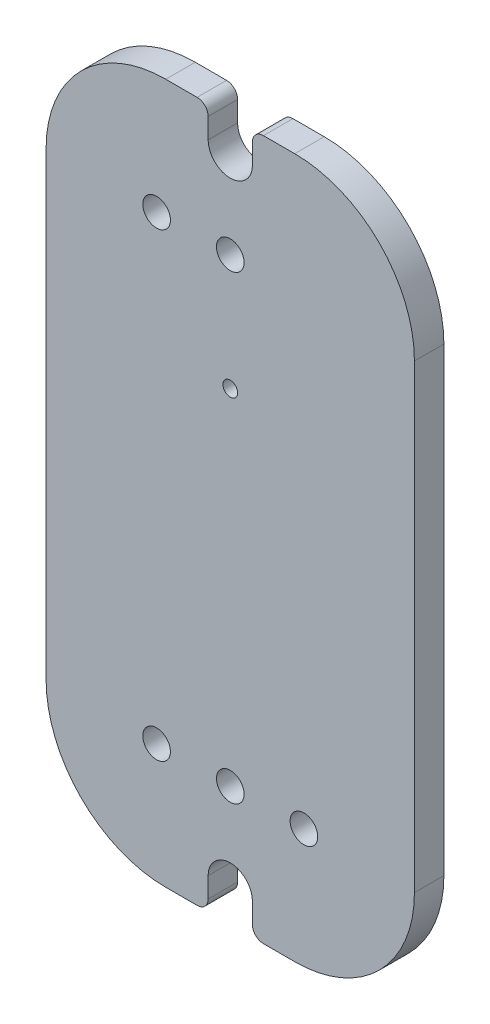
ISO-10303-21;
HEADER;
FILE_DESCRIPTION(('STEP AP214'),'2;1');
FILE_NAME('part.step','',(''),(''),'','','');
FILE_SCHEMA(('AUTOMOTIVE_DESIGN { 1 0 10303 214 1 1 1 1 }'));
ENDSEC;
DATA;
#1=APPLICATION_CONTEXT('core data for automotive mechanical design processes');
#2=APPLICATION_PROTOCOL_DEFINITION('international standard','automotive_design',2000,#1);
#3=PRODUCT_CONTEXT('',#1,'mechanical');
#4=PRODUCT('Part','Part','',(#3));
#5=PRODUCT_RELATED_PRODUCT_CATEGORY('part','',(#4));
#6=PRODUCT_DEFINITION_FORMATION('','',#4);
#7=PRODUCT_DEFINITION_CONTEXT('part definition',#1,'design');
#8=PRODUCT_DEFINITION('design','',#6,#7);
#9=PRODUCT_DEFINITION_SHAPE('','',#8);
#10=(LENGTH_UNIT() NAMED_UNIT(*) SI_UNIT(.MILLI.,.METRE.));
#11=(NAMED_UNIT(*) PLANE_ANGLE_UNIT() SI_UNIT($,.RADIAN.));
#12=(NAMED_UNIT(*) SI_UNIT($,.STERADIAN.) SOLID_ANGLE_UNIT());
#13=UNCERTAINTY_MEASURE_WITH_UNIT(LENGTH_MEASURE(1.E-05),#10,'distance_accuracy_value','');
#14=(GEOMETRIC_REPRESENTATION_CONTEXT(3) GLOBAL_UNCERTAINTY_ASSIGNED_CONTEXT((#13)) GLOBAL_UNIT_ASSIGNED_CONTEXT((#10,
#11,#12)) REPRESENTATION_CONTEXT('',''));
#15=CARTESIAN_POINT('',(0.,0.,0.));
#16=DIRECTION('',(0.,0.,1.));
#17=DIRECTION('',(1.,0.,0.));
#18=AXIS2_PLACEMENT_3D('',#15,#16,#17);
#19=CARTESIAN_POINT('',(-0.6,8.65,0.8));
#20=DIRECTION('',(-1.,0.,0.));
#21=DIRECTION('',(0.,0.,1.));
#22=AXIS2_PLACEMENT_3D('',#19,#20,#21);
#23=PLANE('',#22);
#24=DIRECTION('',(0.,1.,0.));
#25=VECTOR('',#24,1.);
#26=CARTESIAN_POINT('',(-0.6,8.65,0.));
#27=LINE('',#26,#25);
#28=CARTESIAN_POINT('',(-0.6,8.65,0.));
#29=VERTEX_POINT('',#28);
#30=CARTESIAN_POINT('',(-0.6,9.2,0.));
#31=VERTEX_POINT('',#30);
#32=EDGE_CURVE('E206',#29,#31,#27,.T.);
#33=ORIENTED_EDGE('',*,*,#32,.T.);
#34=DIRECTION('',(0.,0.,-1.));
#35=VECTOR('',#34,1.);
#36=CARTESIAN_POINT('',(-0.6,9.2,0.8));
#37=LINE('',#36,#35);
#38=CARTESIAN_POINT('',(-0.6,9.2,0.8));
#39=VERTEX_POINT('',#38);
#40=EDGE_CURVE('E42',#39,#31,#37,.T.);
#41=ORIENTED_EDGE('',*,*,#40,.F.);
#42=DIRECTION('',(0.,1.,0.));
#43=VECTOR('',#42,1.);
#44=CARTESIAN_POINT('',(-0.6,8.65,0.8));
#45=LINE('',#44,#43);
#46=CARTESIAN_POINT('',(-0.6,8.65,0.8));
#47=VERTEX_POINT('',#46);
#48=EDGE_CURVE('E130',#47,#39,#45,.T.);
#49=ORIENTED_EDGE('',*,*,#48,.F.);
#50=DIRECTION('',(0.,0.,-1.));
#51=VECTOR('',#50,1.);
#52=CARTESIAN_POINT('',(-0.6,8.65,0.8));
#53=LINE('',#52,#51);
#54=EDGE_CURVE('E11',#47,#29,#53,.T.);
#55=ORIENTED_EDGE('',*,*,#54,.T.);
#56=EDGE_LOOP('',(#33,#41,#49,#55));
#57=FACE_BOUND('',#56,.T.);
#58=ADVANCED_FACE('F34',(#57),#23,.F.);
#59=CARTESIAN_POINT('',(-0.900000000000001,9.2,0.8));
#60=DIRECTION('',(0.,0.,-1.));
#61=DIRECTION('',(-1.,0.,0.));
#62=AXIS2_PLACEMENT_3D('',#59,#60,#61);
#63=CYLINDRICAL_SURFACE('',#62,0.3);
#64=CARTESIAN_POINT('',(-0.900000000000001,9.2,0.));
#65=DIRECTION('',(0.,0.,1.));
#66=DIRECTION('',(1.,0.,0.));
#67=AXIS2_PLACEMENT_3D('',#64,#65,#66);
#68=CIRCLE('',#67,0.3);
#69=CARTESIAN_POINT('',(-0.9,9.5,0.));
#70=VERTEX_POINT('',#69);
#71=EDGE_CURVE('E208',#31,#70,#68,.T.);
#72=ORIENTED_EDGE('',*,*,#71,.T.);
#73=DIRECTION('',(0.,0.,-1.));
#74=VECTOR('',#73,1.);
#75=CARTESIAN_POINT('',(-0.9,9.5,0.8));
#76=LINE('',#75,#74);
#77=CARTESIAN_POINT('',(-0.9,9.5,0.8));
#78=VERTEX_POINT('',#77);
#79=EDGE_CURVE('E287',#78,#70,#76,.T.);
#80=ORIENTED_EDGE('',*,*,#79,.F.);
#81=CARTESIAN_POINT('',(-0.900000000000001,9.2,0.8));
#82=DIRECTION('',(0.,0.,1.));
#83=DIRECTION('',(1.,0.,0.));
#84=AXIS2_PLACEMENT_3D('',#81,#82,#83);
#85=CIRCLE('',#84,0.3);
#86=EDGE_CURVE('E295',#39,#78,#85,.T.);
#87=ORIENTED_EDGE('',*,*,#86,.F.);
#88=ORIENTED_EDGE('',*,*,#40,.T.);
#89=EDGE_LOOP('',(#72,#80,#87,#88));
#90=FACE_BOUND('',#89,.T.);
#91=ADVANCED_FACE('F293',(#90),#63,.T.);
#92=CARTESIAN_POINT('',(-0.9,9.5,0.8));
#93=DIRECTION('',(0.,-1.,0.));
#94=DIRECTION('',(0.,0.,-1.));
#95=AXIS2_PLACEMENT_3D('',#92,#93,#94);
#96=PLANE('',#95);
#97=DIRECTION('',(-1.,0.,0.));
#98=VECTOR('',#97,1.);
#99=CARTESIAN_POINT('',(-0.9,9.5,0.));
#100=LINE('',#99,#98);
#101=CARTESIAN_POINT('',(-1.75,9.5,0.));
#102=VERTEX_POINT('',#101);
#103=EDGE_CURVE('E211',#70,#102,#100,.T.);
#104=ORIENTED_EDGE('',*,*,#103,.T.);
#105=DIRECTION('',(0.,0.,-1.));
#106=VECTOR('',#105,1.);
#107=CARTESIAN_POINT('',(-1.75,9.5,0.8));
#108=LINE('',#107,#106);
#109=CARTESIAN_POINT('',(-1.75,9.5,0.8));
#110=VERTEX_POINT('',#109);
#111=EDGE_CURVE('E284',#110,#102,#108,.T.);
#112=ORIENTED_EDGE('',*,*,#111,.F.);
#113=DIRECTION('',(-1.,0.,0.));
#114=VECTOR('',#113,1.);
#115=CARTESIAN_POINT('',(-0.9,9.5,0.8));
#116=LINE('',#115,#114);
#117=EDGE_CURVE('E314',#78,#110,#116,.T.);
#118=ORIENTED_EDGE('',*,*,#117,.F.);
#119=ORIENTED_EDGE('',*,*,#79,.T.);
#120=EDGE_LOOP('',(#104,#112,#118,#119));
#121=FACE_BOUND('',#120,.T.);
#122=ADVANCED_FACE('F305',(#121),#96,.F.);
#123=CARTESIAN_POINT('',(-1.75,6.25,0.8));
#124=DIRECTION('',(0.,0.,-1.));
#125=DIRECTION('',(-1.,0.,0.));
#126=AXIS2_PLACEMENT_3D('',#123,#124,#125);
#127=CYLINDRICAL_SURFACE('',#126,3.25);
#128=CARTESIAN_POINT('',(-1.75,6.25,0.));
#129=DIRECTION('',(0.,0.,1.));
#130=DIRECTION('',(1.,0.,0.));
#131=AXIS2_PLACEMENT_3D('',#128,#129,#130);
#132=CIRCLE('',#131,3.25);
#133=CARTESIAN_POINT('',(-5.,6.25,0.));
#134=VERTEX_POINT('',#133);
#135=EDGE_CURVE('E213',#102,#134,#132,.T.);
#136=ORIENTED_EDGE('',*,*,#135,.T.);
#137=DIRECTION('',(0.,0.,-1.));
#138=VECTOR('',#137,1.);
#139=CARTESIAN_POINT('',(-5.,6.25,0.8));
#140=LINE('',#139,#138);
#141=CARTESIAN_POINT('',(-5.,6.25,0.8));
#142=VERTEX_POINT('',#141);
#143=EDGE_CURVE('E281',#142,#134,#140,.T.);
#144=ORIENTED_EDGE('',*,*,#143,.F.);
#145=CARTESIAN_POINT('',(-1.75,6.25,0.8));
#146=DIRECTION('',(0.,0.,1.));
#147=DIRECTION('',(1.,0.,0.));
#148=AXIS2_PLACEMENT_3D('',#145,#146,#147);
#149=CIRCLE('',#148,3.25);
#150=EDGE_CURVE('E311',#110,#142,#149,.T.);
#151=ORIENTED_EDGE('',*,*,#150,.F.);
#152=ORIENTED_EDGE('',*,*,#111,.T.);
#153=EDGE_LOOP('',(#136,#144,#151,#152));
#154=FACE_BOUND('',#153,.T.);
#155=ADVANCED_FACE('F309',(#154),#127,.T.);
#156=CARTESIAN_POINT('',(-5.,6.25,0.8));
#157=DIRECTION('',(1.,0.,0.));
#158=DIRECTION('',(0.,0.,-1.));
#159=AXIS2_PLACEMENT_3D('',#156,#157,#158);
#160=PLANE('',#159);
#161=DIRECTION('',(0.,-1.,0.));
#162=VECTOR('',#161,1.);
#163=CARTESIAN_POINT('',(-5.,6.25,0.));
#164=LINE('',#163,#162);
#165=CARTESIAN_POINT('',(-5.,-6.25,0.));
#166=VERTEX_POINT('',#165);
#167=EDGE_CURVE('E215',#134,#166,#164,.T.);
#168=ORIENTED_EDGE('',*,*,#167,.T.);
#169=DIRECTION('',(0.,0.,-1.));
#170=VECTOR('',#169,1.);
#171=CARTESIAN_POINT('',(-5.,-6.25,0.8));
#172=LINE('',#171,#170);
#173=CARTESIAN_POINT('',(-5.,-6.25,0.8));
#174=VERTEX_POINT('',#173);
#175=EDGE_CURVE('E278',#174,#166,#172,.T.);
#176=ORIENTED_EDGE('',*,*,#175,.F.);
#177=DIRECTION('',(0.,-1.,0.));
#178=VECTOR('',#177,1.);
#179=CARTESIAN_POINT('',(-5.,6.25,0.8));
#180=LINE('',#179,#178);
#181=EDGE_CURVE('E313',#142,#174,#180,.T.);
#182=ORIENTED_EDGE('',*,*,#181,.F.);
#183=ORIENTED_EDGE('',*,*,#143,.T.);
#184=EDGE_LOOP('',(#168,#176,#182,#183));
#185=FACE_BOUND('',#184,.T.);
#186=ADVANCED_FACE('F431',(#185),#160,.F.);
#187=CARTESIAN_POINT('',(-1.75,-6.25,0.8));
#188=DIRECTION('',(0.,0.,-1.));
#189=DIRECTION('',(-1.,0.,0.));
#190=AXIS2_PLACEMENT_3D('',#187,#188,#189);
#191=CYLINDRICAL_SURFACE('',#190,3.25);
#192=CARTESIAN_POINT('',(-1.75,-6.25,0.));
#193=DIRECTION('',(0.,0.,1.));
#194=DIRECTION('',(1.,0.,0.));
#195=AXIS2_PLACEMENT_3D('',#192,#193,#194);
#196=CIRCLE('',#195,3.25);
#197=CARTESIAN_POINT('',(-1.75,-9.5,0.));
#198=VERTEX_POINT('',#197);
#199=EDGE_CURVE('E217',#166,#198,#196,.T.);
#200=ORIENTED_EDGE('',*,*,#199,.T.);
#201=DIRECTION('',(0.,0.,-1.));
#202=VECTOR('',#201,1.);
#203=CARTESIAN_POINT('',(-1.75,-9.5,0.8));
#204=LINE('',#203,#202);
#205=CARTESIAN_POINT('',(-1.75,-9.5,0.8));
#206=VERTEX_POINT('',#205);
#207=EDGE_CURVE('E275',#206,#198,#204,.T.);
#208=ORIENTED_EDGE('',*,*,#207,.F.);
#209=CARTESIAN_POINT('',(-1.75,-6.25,0.8));
#210=DIRECTION('',(0.,0.,1.));
#211=DIRECTION('',(1.,0.,0.));
#212=AXIS2_PLACEMENT_3D('',#209,#210,#211);
#213=CIRCLE('',#212,3.25);
#214=EDGE_CURVE('E316',#174,#206,#213,.T.);
#215=ORIENTED_EDGE('',*,*,#214,.F.);
#216=ORIENTED_EDGE('',*,*,#175,.T.);
#217=EDGE_LOOP('',(#200,#208,#215,#216));
#218=FACE_BOUND('',#217,.T.);
#219=ADVANCED_FACE('F434',(#218),#191,.T.);
#220=CARTESIAN_POINT('',(-1.75,-9.5,0.8));
#221=DIRECTION('',(0.,1.,0.));
#222=DIRECTION('',(0.,0.,1.));
#223=AXIS2_PLACEMENT_3D('',#220,#221,#222);
#224=PLANE('',#223);
#225=DIRECTION('',(1.,0.,0.));
#226=VECTOR('',#225,1.);
#227=CARTESIAN_POINT('',(-1.75,-9.5,0.));
#228=LINE('',#227,#226);
#229=CARTESIAN_POINT('',(-0.9,-9.5,0.));
#230=VERTEX_POINT('',#229);
#231=EDGE_CURVE('E219',#198,#230,#228,.T.);
#232=ORIENTED_EDGE('',*,*,#231,.T.);
#233=DIRECTION('',(0.,0.,-1.));
#234=VECTOR('',#233,1.);
#235=CARTESIAN_POINT('',(-0.9,-9.5,0.8));
#236=LINE('',#235,#234);
#237=CARTESIAN_POINT('',(-0.9,-9.5,0.8));
#238=VERTEX_POINT('',#237);
#239=EDGE_CURVE('E272',#238,#230,#236,.T.);
#240=ORIENTED_EDGE('',*,*,#239,.F.);
#241=DIRECTION('',(1.,0.,0.));
#242=VECTOR('',#241,1.);
#243=CARTESIAN_POINT('',(-1.75,-9.5,0.8));
#244=LINE('',#243,#242);
#245=EDGE_CURVE('E322',#206,#238,#244,.T.);
#246=ORIENTED_EDGE('',*,*,#245,.F.);
#247=ORIENTED_EDGE('',*,*,#207,.T.);
#248=EDGE_LOOP('',(#232,#240,#246,#247));
#249=FACE_BOUND('',#248,.T.);
#250=ADVANCED_FACE('F438',(#249),#224,.F.);
#251=CARTESIAN_POINT('',(-0.899999999999999,-9.2,0.8));
#252=DIRECTION('',(0.,0.,-1.));
#253=DIRECTION('',(-1.,0.,0.));
#254=AXIS2_PLACEMENT_3D('',#251,#252,#253);
#255=CYLINDRICAL_SURFACE('',#254,0.3);
#256=CARTESIAN_POINT('',(-0.899999999999999,-9.2,0.));
#257=DIRECTION('',(0.,0.,1.));
#258=DIRECTION('',(1.,0.,0.));
#259=AXIS2_PLACEMENT_3D('',#256,#257,#258);
#260=CIRCLE('',#259,0.3);
#261=CARTESIAN_POINT('',(-0.6,-9.2,0.));
#262=VERTEX_POINT('',#261);
#263=EDGE_CURVE('E221',#230,#262,#260,.T.);
#264=ORIENTED_EDGE('',*,*,#263,.T.);
#265=DIRECTION('',(0.,0.,-1.));
#266=VECTOR('',#265,1.);
#267=CARTESIAN_POINT('',(-0.6,-9.2,0.8));
#268=LINE('',#267,#266);
#269=CARTESIAN_POINT('',(-0.6,-9.2,0.8));
#270=VERTEX_POINT('',#269);
#271=EDGE_CURVE('E269',#270,#262,#268,.T.);
#272=ORIENTED_EDGE('',*,*,#271,.F.);
#273=CARTESIAN_POINT('',(-0.899999999999999,-9.2,0.8));
#274=DIRECTION('',(0.,0.,1.));
#275=DIRECTION('',(1.,0.,0.));
#276=AXIS2_PLACEMENT_3D('',#273,#274,#275);
#277=CIRCLE('',#276,0.3);
#278=EDGE_CURVE('E324',#238,#270,#277,.T.);
#279=ORIENTED_EDGE('',*,*,#278,.F.);
#280=ORIENTED_EDGE('',*,*,#239,.T.);
#281=EDGE_LOOP('',(#264,#272,#279,#280));
#282=FACE_BOUND('',#281,.T.);
#283=ADVANCED_FACE('F442',(#282),#255,.T.);
#284=CARTESIAN_POINT('',(-0.6,-9.2,0.8));
#285=DIRECTION('',(-1.,0.,0.));
#286=DIRECTION('',(0.,0.,1.));
#287=AXIS2_PLACEMENT_3D('',#284,#285,#286);
#288=PLANE('',#287);
#289=DIRECTION('',(0.,1.,0.));
#290=VECTOR('',#289,1.);
#291=CARTESIAN_POINT('',(-0.6,-9.2,0.));
#292=LINE('',#291,#290);
#293=CARTESIAN_POINT('',(-0.6,-8.65,0.));
#294=VERTEX_POINT('',#293);
#295=EDGE_CURVE('E223',#262,#294,#292,.T.);
#296=ORIENTED_EDGE('',*,*,#295,.T.);
#297=DIRECTION('',(0.,0.,-1.));
#298=VECTOR('',#297,1.);
#299=CARTESIAN_POINT('',(-0.6,-8.65,0.8));
#300=LINE('',#299,#298);
#301=CARTESIAN_POINT('',(-0.6,-8.65,0.8));
#302=VERTEX_POINT('',#301);
#303=EDGE_CURVE('E266',#302,#294,#300,.T.);
#304=ORIENTED_EDGE('',*,*,#303,.F.);
#305=DIRECTION('',(0.,1.,0.));
#306=VECTOR('',#305,1.);
#307=CARTESIAN_POINT('',(-0.6,-9.2,0.8));
#308=LINE('',#307,#306);
#309=EDGE_CURVE('E326',#270,#302,#308,.T.);
#310=ORIENTED_EDGE('',*,*,#309,.F.);
#311=ORIENTED_EDGE('',*,*,#271,.T.);
#312=EDGE_LOOP('',(#296,#304,#310,#311));
#313=FACE_BOUND('',#312,.T.);
#314=ADVANCED_FACE('F446',(#313),#288,.F.);
#315=CARTESIAN_POINT('',(0.,-8.65,0.8));
#316=DIRECTION('',(0.,0.,-1.));
#317=DIRECTION('',(-1.,0.,0.));
#318=AXIS2_PLACEMENT_3D('',#315,#316,#317);
#319=CYLINDRICAL_SURFACE('',#318,0.6);
#320=CARTESIAN_POINT('',(0.,-8.65,0.));
#321=DIRECTION('',(0.,0.,-1.));
#322=DIRECTION('',(-1.,0.,0.));
#323=AXIS2_PLACEMENT_3D('',#320,#321,#322);
#324=CIRCLE('',#323,0.6);
#325=CARTESIAN_POINT('',(0.6,-8.65,0.));
#326=VERTEX_POINT('',#325);
#327=EDGE_CURVE('E226',#294,#326,#324,.T.);
#328=ORIENTED_EDGE('',*,*,#327,.T.);
#329=DIRECTION('',(0.,0.,-1.));
#330=VECTOR('',#329,1.);
#331=CARTESIAN_POINT('',(0.6,-8.65,0.8));
#332=LINE('',#331,#330);
#333=CARTESIAN_POINT('',(0.6,-8.65,0.8));
#334=VERTEX_POINT('',#333);
#335=EDGE_CURVE('E263',#334,#326,#332,.T.);
#336=ORIENTED_EDGE('',*,*,#335,.F.);
#337=CARTESIAN_POINT('',(0.,-8.65,0.8));
#338=DIRECTION('',(0.,0.,-1.));
#339=DIRECTION('',(-1.,0.,0.));
#340=AXIS2_PLACEMENT_3D('',#337,#338,#339);
#341=CIRCLE('',#340,0.6);
#342=EDGE_CURVE('E328',#302,#334,#341,.T.);
#343=ORIENTED_EDGE('',*,*,#342,.F.);
#344=ORIENTED_EDGE('',*,*,#303,.T.);
#345=EDGE_LOOP('',(#328,#336,#343,#344));
#346=FACE_BOUND('',#345,.T.);
#347=ADVANCED_FACE('F450',(#346),#319,.F.);
#348=CARTESIAN_POINT('',(0.6,-8.65,0.8));
#349=DIRECTION('',(1.,0.,0.));
#350=DIRECTION('',(0.,0.,-1.));
#351=AXIS2_PLACEMENT_3D('',#348,#349,#350);
#352=PLANE('',#351);
#353=DIRECTION('',(0.,-1.,0.));
#354=VECTOR('',#353,1.);
#355=CARTESIAN_POINT('',(0.6,-8.65,0.));
#356=LINE('',#355,#354);
#357=CARTESIAN_POINT('',(0.6,-9.2,0.));
#358=VERTEX_POINT('',#357);
#359=EDGE_CURVE('E228',#326,#358,#356,.T.);
#360=ORIENTED_EDGE('',*,*,#359,.T.);
#361=DIRECTION('',(0.,0.,-1.));
#362=VECTOR('',#361,1.);
#363=CARTESIAN_POINT('',(0.6,-9.2,0.8));
#364=LINE('',#363,#362);
#365=CARTESIAN_POINT('',(0.6,-9.2,0.8));
#366=VERTEX_POINT('',#365);
#367=EDGE_CURVE('E260',#366,#358,#364,.T.);
#368=ORIENTED_EDGE('',*,*,#367,.F.);
#369=DIRECTION('',(0.,-1.,0.));
#370=VECTOR('',#369,1.);
#371=CARTESIAN_POINT('',(0.6,-8.65,0.8));
#372=LINE('',#371,#370);
#373=EDGE_CURVE('E330',#334,#366,#372,.T.);
#374=ORIENTED_EDGE('',*,*,#373,.F.);
#375=ORIENTED_EDGE('',*,*,#335,.T.);
#376=EDGE_LOOP('',(#360,#368,#374,#375));
#377=FACE_BOUND('',#376,.T.);
#378=ADVANCED_FACE('F454',(#377),#352,.F.);
#379=CARTESIAN_POINT('',(0.900000000000001,-9.2,0.8));
#380=DIRECTION('',(0.,0.,-1.));
#381=DIRECTION('',(-1.,0.,0.));
#382=AXIS2_PLACEMENT_3D('',#379,#380,#381);
#383=CYLINDRICAL_SURFACE('',#382,0.3);
#384=CARTESIAN_POINT('',(0.900000000000001,-9.2,0.));
#385=DIRECTION('',(0.,0.,1.));
#386=DIRECTION('',(1.,0.,0.));
#387=AXIS2_PLACEMENT_3D('',#384,#385,#386);
#388=CIRCLE('',#387,0.3);
#389=CARTESIAN_POINT('',(0.9,-9.5,0.));
#390=VERTEX_POINT('',#389);
#391=EDGE_CURVE('E230',#358,#390,#388,.T.);
#392=ORIENTED_EDGE('',*,*,#391,.T.);
#393=DIRECTION('',(0.,0.,-1.));
#394=VECTOR('',#393,1.);
#395=CARTESIAN_POINT('',(0.9,-9.5,0.8));
#396=LINE('',#395,#394);
#397=CARTESIAN_POINT('',(0.9,-9.5,0.8));
#398=VERTEX_POINT('',#397);
#399=EDGE_CURVE('E257',#398,#390,#396,.T.);
#400=ORIENTED_EDGE('',*,*,#399,.F.);
#401=CARTESIAN_POINT('',(0.900000000000001,-9.2,0.8));
#402=DIRECTION('',(0.,0.,1.));
#403=DIRECTION('',(1.,0.,0.));
#404=AXIS2_PLACEMENT_3D('',#401,#402,#403);
#405=CIRCLE('',#404,0.3);
#406=EDGE_CURVE('E332',#366,#398,#405,.T.);
#407=ORIENTED_EDGE('',*,*,#406,.F.);
#408=ORIENTED_EDGE('',*,*,#367,.T.);
#409=EDGE_LOOP('',(#392,#400,#407,#408));
#410=FACE_BOUND('',#409,.T.);
#411=ADVANCED_FACE('F458',(#410),#383,.T.);
#412=CARTESIAN_POINT('',(0.9,-9.5,0.8));
#413=DIRECTION('',(0.,1.,0.));
#414=DIRECTION('',(0.,0.,1.));
#415=AXIS2_PLACEMENT_3D('',#412,#413,#414);
#416=PLANE('',#415);
#417=DIRECTION('',(1.,0.,0.));
#418=VECTOR('',#417,1.);
#419=CARTESIAN_POINT('',(0.9,-9.5,0.));
#420=LINE('',#419,#418);
#421=CARTESIAN_POINT('',(1.75,-9.5,0.));
#422=VERTEX_POINT('',#421);
#423=EDGE_CURVE('E232',#390,#422,#420,.T.);
#424=ORIENTED_EDGE('',*,*,#423,.T.);
#425=DIRECTION('',(0.,0.,-1.));
#426=VECTOR('',#425,1.);
#427=CARTESIAN_POINT('',(1.75,-9.5,0.8));
#428=LINE('',#427,#426);
#429=CARTESIAN_POINT('',(1.75,-9.5,0.8));
#430=VERTEX_POINT('',#429);
#431=EDGE_CURVE('E254',#430,#422,#428,.T.);
#432=ORIENTED_EDGE('',*,*,#431,.F.);
#433=DIRECTION('',(1.,0.,0.));
#434=VECTOR('',#433,1.);
#435=CARTESIAN_POINT('',(0.9,-9.5,0.8));
#436=LINE('',#435,#434);
#437=EDGE_CURVE('E334',#398,#430,#436,.T.);
#438=ORIENTED_EDGE('',*,*,#437,.F.);
#439=ORIENTED_EDGE('',*,*,#399,.T.);
#440=EDGE_LOOP('',(#424,#432,#438,#439));
#441=FACE_BOUND('',#440,.T.);
#442=ADVANCED_FACE('F462',(#441),#416,.F.);
#443=CARTESIAN_POINT('',(1.75,-6.25,0.8));
#444=DIRECTION('',(0.,0.,-1.));
#445=DIRECTION('',(-1.,0.,0.));
#446=AXIS2_PLACEMENT_3D('',#443,#444,#445);
#447=CYLINDRICAL_SURFACE('',#446,3.25);
#448=CARTESIAN_POINT('',(1.75,-6.25,0.));
#449=DIRECTION('',(0.,0.,1.));
#450=DIRECTION('',(1.,0.,0.));
#451=AXIS2_PLACEMENT_3D('',#448,#449,#450);
#452=CIRCLE('',#451,3.25);
#453=CARTESIAN_POINT('',(5.,-6.25,0.));
#454=VERTEX_POINT('',#453);
#455=EDGE_CURVE('E234',#422,#454,#452,.T.);
#456=ORIENTED_EDGE('',*,*,#455,.T.);
#457=DIRECTION('',(0.,0.,-1.));
#458=VECTOR('',#457,1.);
#459=CARTESIAN_POINT('',(5.,-6.25,0.8));
#460=LINE('',#459,#458);
#461=CARTESIAN_POINT('',(5.,-6.25,0.8));
#462=VERTEX_POINT('',#461);
#463=EDGE_CURVE('E251',#462,#454,#460,.T.);
#464=ORIENTED_EDGE('',*,*,#463,.F.);
#465=CARTESIAN_POINT('',(1.75,-6.25,0.8));
#466=DIRECTION('',(0.,0.,1.));
#467=DIRECTION('',(1.,0.,0.));
#468=AXIS2_PLACEMENT_3D('',#465,#466,#467);
#469=CIRCLE('',#468,3.25);
#470=EDGE_CURVE('E336',#430,#462,#469,.T.);
#471=ORIENTED_EDGE('',*,*,#470,.F.);
#472=ORIENTED_EDGE('',*,*,#431,.T.);
#473=EDGE_LOOP('',(#456,#464,#471,#472));
#474=FACE_BOUND('',#473,.T.);
#475=ADVANCED_FACE('F466',(#474),#447,.T.);
#476=CARTESIAN_POINT('',(5.,-6.25,0.8));
#477=DIRECTION('',(-1.,0.,0.));
#478=DIRECTION('',(0.,0.,1.));
#479=AXIS2_PLACEMENT_3D('',#476,#477,#478);
#480=PLANE('',#479);
#481=DIRECTION('',(0.,1.,0.));
#482=VECTOR('',#481,1.);
#483=CARTESIAN_POINT('',(5.,-6.25,0.));
#484=LINE('',#483,#482);
#485=CARTESIAN_POINT('',(5.,6.25,0.));
#486=VERTEX_POINT('',#485);
#487=EDGE_CURVE('E236',#454,#486,#484,.T.);
#488=ORIENTED_EDGE('',*,*,#487,.T.);
#489=DIRECTION('',(0.,0.,-1.));
#490=VECTOR('',#489,1.);
#491=CARTESIAN_POINT('',(5.,6.25,0.8));
#492=LINE('',#491,#490);
#493=CARTESIAN_POINT('',(5.,6.25,0.8));
#494=VERTEX_POINT('',#493);
#495=EDGE_CURVE('E248',#494,#486,#492,.T.);
#496=ORIENTED_EDGE('',*,*,#495,.F.);
#497=DIRECTION('',(0.,1.,0.));
#498=VECTOR('',#497,1.);
#499=CARTESIAN_POINT('',(5.,-6.25,0.8));
#500=LINE('',#499,#498);
#501=EDGE_CURVE('E338',#462,#494,#500,.T.);
#502=ORIENTED_EDGE('',*,*,#501,.F.);
#503=ORIENTED_EDGE('',*,*,#463,.T.);
#504=EDGE_LOOP('',(#488,#496,#502,#503));
#505=FACE_BOUND('',#504,.T.);
#506=ADVANCED_FACE('F344',(#505),#480,.F.);
#507=CARTESIAN_POINT('',(1.75,6.25,0.8));
#508=DIRECTION('',(0.,0.,-1.));
#509=DIRECTION('',(-1.,0.,0.));
#510=AXIS2_PLACEMENT_3D('',#507,#508,#509);
#511=CYLINDRICAL_SURFACE('',#510,3.25);
#512=CARTESIAN_POINT('',(1.75,6.25,0.));
#513=DIRECTION('',(0.,0.,1.));
#514=DIRECTION('',(1.,0.,0.));
#515=AXIS2_PLACEMENT_3D('',#512,#513,#514);
#516=CIRCLE('',#515,3.25);
#517=CARTESIAN_POINT('',(1.75,9.5,0.));
#518=VERTEX_POINT('',#517);
#519=EDGE_CURVE('E238',#486,#518,#516,.T.);
#520=ORIENTED_EDGE('',*,*,#519,.T.);
#521=DIRECTION('',(0.,0.,-1.));
#522=VECTOR('',#521,1.);
#523=CARTESIAN_POINT('',(1.75,9.5,0.8));
#524=LINE('',#523,#522);
#525=CARTESIAN_POINT('',(1.75,9.5,0.8));
#526=VERTEX_POINT('',#525);
#527=EDGE_CURVE('E195',#526,#518,#524,.T.);
#528=ORIENTED_EDGE('',*,*,#527,.F.);
#529=CARTESIAN_POINT('',(1.75,6.25,0.8));
#530=DIRECTION('',(0.,0.,1.));
#531=DIRECTION('',(1.,0.,0.));
#532=AXIS2_PLACEMENT_3D('',#529,#530,#531);
#533=CIRCLE('',#532,3.25);
#534=EDGE_CURVE('E186',#494,#526,#533,.T.);
#535=ORIENTED_EDGE('',*,*,#534,.F.);
#536=ORIENTED_EDGE('',*,*,#495,.T.);
#537=EDGE_LOOP('',(#520,#528,#535,#536));
#538=FACE_BOUND('',#537,.T.);
#539=ADVANCED_FACE('F348',(#538),#511,.T.);
#540=CARTESIAN_POINT('',(1.75,9.5,0.8));
#541=DIRECTION('',(0.,-1.,0.));
#542=DIRECTION('',(0.,0.,-1.));
#543=AXIS2_PLACEMENT_3D('',#540,#541,#542);
#544=PLANE('',#543);
#545=DIRECTION('',(-1.,0.,0.));
#546=VECTOR('',#545,1.);
#547=CARTESIAN_POINT('',(1.75,9.5,0.));
#548=LINE('',#547,#546);
#549=CARTESIAN_POINT('',(0.9,9.5,0.));
#550=VERTEX_POINT('',#549);
#551=EDGE_CURVE('E194',#518,#550,#548,.T.);
#552=ORIENTED_EDGE('',*,*,#551,.T.);
#553=DIRECTION('',(0.,0.,-1.));
#554=VECTOR('',#553,1.);
#555=CARTESIAN_POINT('',(0.9,9.5,0.8));
#556=LINE('',#555,#554);
#557=CARTESIAN_POINT('',(0.9,9.5,0.8));
#558=VERTEX_POINT('',#557);
#559=EDGE_CURVE('E191',#558,#550,#556,.T.);
#560=ORIENTED_EDGE('',*,*,#559,.F.);
#561=DIRECTION('',(-1.,0.,0.));
#562=VECTOR('',#561,1.);
#563=CARTESIAN_POINT('',(1.75,9.5,0.8));
#564=LINE('',#563,#562);
#565=EDGE_CURVE('E180',#526,#558,#564,.T.);
#566=ORIENTED_EDGE('',*,*,#565,.F.);
#567=ORIENTED_EDGE('',*,*,#527,.T.);
#568=EDGE_LOOP('',(#552,#560,#566,#567));
#569=FACE_BOUND('',#568,.T.);
#570=ADVANCED_FACE('F192',(#569),#544,.F.);
#571=CARTESIAN_POINT('',(0.899999999999999,9.2,0.8));
#572=DIRECTION('',(0.,0.,-1.));
#573=DIRECTION('',(-1.,0.,0.));
#574=AXIS2_PLACEMENT_3D('',#571,#572,#573);
#575=CYLINDRICAL_SURFACE('',#574,0.3);
#576=CARTESIAN_POINT('',(0.899999999999999,9.2,0.));
#577=DIRECTION('',(0.,0.,1.));
#578=DIRECTION('',(1.,0.,0.));
#579=AXIS2_PLACEMENT_3D('',#576,#577,#578);
#580=CIRCLE('',#579,0.3);
#581=CARTESIAN_POINT('',(0.6,9.2,0.));
#582=VERTEX_POINT('',#581);
#583=EDGE_CURVE('E116',#550,#582,#580,.T.);
#584=ORIENTED_EDGE('',*,*,#583,.T.);
#585=DIRECTION('',(0.,0.,-1.));
#586=VECTOR('',#585,1.);
#587=CARTESIAN_POINT('',(0.6,9.2,0.8));
#588=LINE('',#587,#586);
#589=CARTESIAN_POINT('',(0.6,9.2,0.8));
#590=VERTEX_POINT('',#589);
#591=EDGE_CURVE('E196',#590,#582,#588,.T.);
#592=ORIENTED_EDGE('',*,*,#591,.F.);
#593=CARTESIAN_POINT('',(0.899999999999999,9.2,0.8));
#594=DIRECTION('',(0.,0.,1.));
#595=DIRECTION('',(1.,0.,0.));
#596=AXIS2_PLACEMENT_3D('',#593,#594,#595);
#597=CIRCLE('',#596,0.3);
#598=EDGE_CURVE('E184',#558,#590,#597,.T.);
#599=ORIENTED_EDGE('',*,*,#598,.F.);
#600=ORIENTED_EDGE('',*,*,#559,.T.);
#601=EDGE_LOOP('',(#584,#592,#599,#600));
#602=FACE_BOUND('',#601,.T.);
#603=ADVANCED_FACE('F198',(#602),#575,.T.);
#604=CARTESIAN_POINT('',(0.6,9.2,0.8));
#605=DIRECTION('',(1.,0.,0.));
#606=DIRECTION('',(0.,0.,-1.));
#607=AXIS2_PLACEMENT_3D('',#604,#605,#606);
#608=PLANE('',#607);
#609=DIRECTION('',(0.,-1.,0.));
#610=VECTOR('',#609,1.);
#611=CARTESIAN_POINT('',(0.6,9.2,0.));
#612=LINE('',#611,#610);
#613=CARTESIAN_POINT('',(0.6,8.65,0.));
#614=VERTEX_POINT('',#613);
#615=EDGE_CURVE('E123',#582,#614,#612,.T.);
#616=ORIENTED_EDGE('',*,*,#615,.T.);
#617=DIRECTION('',(0.,0.,-1.));
#618=VECTOR('',#617,1.);
#619=CARTESIAN_POINT('',(0.6,8.65,0.8));
#620=LINE('',#619,#618);
#621=CARTESIAN_POINT('',(0.6,8.65,0.8));
#622=VERTEX_POINT('',#621);
#623=EDGE_CURVE('E202',#622,#614,#620,.T.);
#624=ORIENTED_EDGE('',*,*,#623,.F.);
#625=DIRECTION('',(0.,-1.,0.));
#626=VECTOR('',#625,1.);
#627=CARTESIAN_POINT('',(0.6,9.2,0.8));
#628=LINE('',#627,#626);
#629=EDGE_CURVE('E200',#590,#622,#628,.T.);
#630=ORIENTED_EDGE('',*,*,#629,.F.);
#631=ORIENTED_EDGE('',*,*,#591,.T.);
#632=EDGE_LOOP('',(#616,#624,#630,#631));
#633=FACE_BOUND('',#632,.T.);
#634=ADVANCED_FACE('F350',(#633),#608,.F.);
#635=CARTESIAN_POINT('',(0.,8.65,0.8));
#636=DIRECTION('',(0.,0.,-1.));
#637=DIRECTION('',(-1.,0.,0.));
#638=AXIS2_PLACEMENT_3D('',#635,#636,#637);
#639=CYLINDRICAL_SURFACE('',#638,0.6);
#640=CARTESIAN_POINT('',(0.,8.65,0.));
#641=DIRECTION('',(0.,0.,-1.));
#642=DIRECTION('',(-1.,0.,0.));
#643=AXIS2_PLACEMENT_3D('',#640,#641,#642);
#644=CIRCLE('',#643,0.6);
#645=EDGE_CURVE('E243',#614,#29,#644,.T.);
#646=ORIENTED_EDGE('',*,*,#645,.T.);
#647=ORIENTED_EDGE('',*,*,#54,.F.);
#648=CARTESIAN_POINT('',(0.,8.65,0.8));
#649=DIRECTION('',(0.,0.,-1.));
#650=DIRECTION('',(-1.,0.,0.));
#651=AXIS2_PLACEMENT_3D('',#648,#649,#650);
#652=CIRCLE('',#651,0.6);
#653=EDGE_CURVE('E50',#622,#47,#652,.T.);
#654=ORIENTED_EDGE('',*,*,#653,.F.);
#655=ORIENTED_EDGE('',*,*,#623,.T.);
#656=EDGE_LOOP('',(#646,#647,#654,#655));
#657=FACE_BOUND('',#656,.T.);
#658=ADVANCED_FACE('F349',(#657),#639,.F.);
#659=CARTESIAN_POINT('',(0.,8.65,0.8));
#660=DIRECTION('',(0.,0.,-1.));
#661=DIRECTION('',(-1.,0.,0.));
#662=AXIS2_PLACEMENT_3D('',#659,#660,#661);
#663=PLANE('',#662);
#664=CARTESIAN_POINT('',(0.,3.1,0.8));
#665=DIRECTION('',(0.,0.,1.));
#666=DIRECTION('',(1.,0.,0.));
#667=AXIS2_PLACEMENT_3D('',#664,#665,#666);
#668=CIRCLE('',#667,0.2);
#669=CARTESIAN_POINT('',(0.2,3.1,0.8));
#670=VERTEX_POINT('',#669);
#671=EDGE_CURVE('E364',#670,#670,#668,.T.);
#672=ORIENTED_EDGE('',*,*,#671,.F.);
#673=EDGE_LOOP('',(#672));
#674=FACE_BOUND('',#673,.T.);
#675=CARTESIAN_POINT('',(0.,-6.25,0.8));
#676=DIRECTION('',(0.,0.,1.));
#677=DIRECTION('',(1.,0.,0.));
#678=AXIS2_PLACEMENT_3D('',#675,#676,#677);
#679=CIRCLE('',#678,0.375);
#680=CARTESIAN_POINT('',(0.375,-6.25,0.8));
#681=VERTEX_POINT('',#680);
#682=EDGE_CURVE('E357',#681,#681,#679,.T.);
#683=ORIENTED_EDGE('',*,*,#682,.F.);
#684=EDGE_LOOP('',(#683));
#685=FACE_BOUND('',#684,.T.);
#686=CARTESIAN_POINT('',(-2.,-6.25,0.8));
#687=DIRECTION('',(0.,0.,1.));
#688=DIRECTION('',(1.,0.,0.));
#689=AXIS2_PLACEMENT_3D('',#686,#687,#688);
#690=CIRCLE('',#689,0.375);
#691=CARTESIAN_POINT('',(-1.625,-6.25,0.8));
#692=VERTEX_POINT('',#691);
#693=EDGE_CURVE('E376',#692,#692,#690,.T.);
#694=ORIENTED_EDGE('',*,*,#693,.F.);
#695=EDGE_LOOP('',(#694));
#696=FACE_BOUND('',#695,.T.);
#697=CARTESIAN_POINT('',(-2.,6.25,0.8));
#698=DIRECTION('',(0.,0.,1.));
#699=DIRECTION('',(1.,0.,0.));
#700=AXIS2_PLACEMENT_3D('',#697,#698,#699);
#701=CIRCLE('',#700,0.375);
#702=CARTESIAN_POINT('',(-1.625,6.25,0.8));
#703=VERTEX_POINT('',#702);
#704=EDGE_CURVE('E370',#703,#703,#701,.T.);
#705=ORIENTED_EDGE('',*,*,#704,.F.);
#706=EDGE_LOOP('',(#705));
#707=FACE_BOUND('',#706,.T.);
#708=CARTESIAN_POINT('',(0.,6.25,0.8));
#709=DIRECTION('',(0.,0.,1.));
#710=DIRECTION('',(1.,0.,0.));
#711=AXIS2_PLACEMENT_3D('',#708,#709,#710);
#712=CIRCLE('',#711,0.375);
#713=CARTESIAN_POINT('',(0.375,6.25,0.8));
#714=VERTEX_POINT('',#713);
#715=EDGE_CURVE('E363',#714,#714,#712,.T.);
#716=ORIENTED_EDGE('',*,*,#715,.F.);
#717=EDGE_LOOP('',(#716));
#718=FACE_BOUND('',#717,.T.);
#719=CARTESIAN_POINT('',(2.,-6.25,0.8));
#720=DIRECTION('',(0.,0.,1.));
#721=DIRECTION('',(1.,0.,0.));
#722=AXIS2_PLACEMENT_3D('',#719,#720,#721);
#723=CIRCLE('',#722,0.375);
#724=CARTESIAN_POINT('',(2.375,-6.25,0.8));
#725=VERTEX_POINT('',#724);
#726=EDGE_CURVE('E209',#725,#725,#723,.T.);
#727=ORIENTED_EDGE('',*,*,#726,.F.);
#728=EDGE_LOOP('',(#727));
#729=FACE_BOUND('',#728,.T.);
#730=ORIENTED_EDGE('',*,*,#653,.T.);
#731=ORIENTED_EDGE('',*,*,#48,.T.);
#732=ORIENTED_EDGE('',*,*,#86,.T.);
#733=ORIENTED_EDGE('',*,*,#117,.T.);
#734=ORIENTED_EDGE('',*,*,#150,.T.);
#735=ORIENTED_EDGE('',*,*,#181,.T.);
#736=ORIENTED_EDGE('',*,*,#214,.T.);
#737=ORIENTED_EDGE('',*,*,#245,.T.);
#738=ORIENTED_EDGE('',*,*,#278,.T.);
#739=ORIENTED_EDGE('',*,*,#309,.T.);
#740=ORIENTED_EDGE('',*,*,#342,.T.);
#741=ORIENTED_EDGE('',*,*,#373,.T.);
#742=ORIENTED_EDGE('',*,*,#406,.T.);
#743=ORIENTED_EDGE('',*,*,#437,.T.);
#744=ORIENTED_EDGE('',*,*,#470,.T.);
#745=ORIENTED_EDGE('',*,*,#501,.T.);
#746=ORIENTED_EDGE('',*,*,#534,.T.);
#747=ORIENTED_EDGE('',*,*,#565,.T.);
#748=ORIENTED_EDGE('',*,*,#598,.T.);
#749=ORIENTED_EDGE('',*,*,#629,.T.);
#750=EDGE_LOOP('',(#730,#731,#732,#733,#734,#735,#736,#737,#738,#739,#740,#741,#742,#743,#744,
#745,#746,#747,#748,#749));
#751=FACE_BOUND('',#750,.T.);
#752=ADVANCED_FACE('F182',(#674,#685,#696,#707,#718,#729,#751),#663,.F.);
#753=CARTESIAN_POINT('',(0.,8.65,0.));
#754=DIRECTION('',(0.,0.,-1.));
#755=DIRECTION('',(-1.,0.,0.));
#756=AXIS2_PLACEMENT_3D('',#753,#754,#755);
#757=PLANE('',#756);
#758=CARTESIAN_POINT('',(0.,3.1,0.));
#759=DIRECTION('',(0.,0.,1.));
#760=DIRECTION('',(1.,0.,0.));
#761=AXIS2_PLACEMENT_3D('',#758,#759,#760);
#762=CIRCLE('',#761,0.2);
#763=CARTESIAN_POINT('',(0.2,3.1,0.));
#764=VERTEX_POINT('',#763);
#765=EDGE_CURVE('E384',#764,#764,#762,.T.);
#766=ORIENTED_EDGE('',*,*,#765,.T.);
#767=EDGE_LOOP('',(#766));
#768=FACE_BOUND('',#767,.T.);
#769=CARTESIAN_POINT('',(0.,-6.25,0.));
#770=DIRECTION('',(0.,0.,1.));
#771=DIRECTION('',(1.,0.,0.));
#772=AXIS2_PLACEMENT_3D('',#769,#770,#771);
#773=CIRCLE('',#772,0.375);
#774=CARTESIAN_POINT('',(0.375,-6.25,0.));
#775=VERTEX_POINT('',#774);
#776=EDGE_CURVE('E379',#775,#775,#773,.T.);
#777=ORIENTED_EDGE('',*,*,#776,.T.);
#778=EDGE_LOOP('',(#777));
#779=FACE_BOUND('',#778,.T.);
#780=CARTESIAN_POINT('',(-2.,-6.25,0.));
#781=DIRECTION('',(0.,0.,1.));
#782=DIRECTION('',(1.,0.,0.));
#783=AXIS2_PLACEMENT_3D('',#780,#781,#782);
#784=CIRCLE('',#783,0.375);
#785=CARTESIAN_POINT('',(-1.625,-6.25,0.));
#786=VERTEX_POINT('',#785);
#787=EDGE_CURVE('E373',#786,#786,#784,.T.);
#788=ORIENTED_EDGE('',*,*,#787,.T.);
#789=EDGE_LOOP('',(#788));
#790=FACE_BOUND('',#789,.T.);
#791=CARTESIAN_POINT('',(-2.,6.25,0.));
#792=DIRECTION('',(0.,0.,1.));
#793=DIRECTION('',(1.,0.,0.));
#794=AXIS2_PLACEMENT_3D('',#791,#792,#793);
#795=CIRCLE('',#794,0.375);
#796=CARTESIAN_POINT('',(-1.625,6.25,0.));
#797=VERTEX_POINT('',#796);
#798=EDGE_CURVE('E367',#797,#797,#795,.T.);
#799=ORIENTED_EDGE('',*,*,#798,.T.);
#800=EDGE_LOOP('',(#799));
#801=FACE_BOUND('',#800,.T.);
#802=CARTESIAN_POINT('',(0.,6.25,0.));
#803=DIRECTION('',(0.,0.,1.));
#804=DIRECTION('',(1.,0.,0.));
#805=AXIS2_PLACEMENT_3D('',#802,#803,#804);
#806=CIRCLE('',#805,0.375);
#807=CARTESIAN_POINT('',(0.375,6.25,0.));
#808=VERTEX_POINT('',#807);
#809=EDGE_CURVE('E360',#808,#808,#806,.T.);
#810=ORIENTED_EDGE('',*,*,#809,.T.);
#811=EDGE_LOOP('',(#810));
#812=FACE_BOUND('',#811,.T.);
#813=CARTESIAN_POINT('',(2.,-6.25,0.));
#814=DIRECTION('',(0.,0.,1.));
#815=DIRECTION('',(1.,0.,0.));
#816=AXIS2_PLACEMENT_3D('',#813,#814,#815);
#817=CIRCLE('',#816,0.375);
#818=CARTESIAN_POINT('',(2.375,-6.25,0.));
#819=VERTEX_POINT('',#818);
#820=EDGE_CURVE('E354',#819,#819,#817,.T.);
#821=ORIENTED_EDGE('',*,*,#820,.T.);
#822=EDGE_LOOP('',(#821));
#823=FACE_BOUND('',#822,.T.);
#824=ORIENTED_EDGE('',*,*,#32,.F.);
#825=ORIENTED_EDGE('',*,*,#645,.F.);
#826=ORIENTED_EDGE('',*,*,#615,.F.);
#827=ORIENTED_EDGE('',*,*,#583,.F.);
#828=ORIENTED_EDGE('',*,*,#551,.F.);
#829=ORIENTED_EDGE('',*,*,#519,.F.);
#830=ORIENTED_EDGE('',*,*,#487,.F.);
#831=ORIENTED_EDGE('',*,*,#455,.F.);
#832=ORIENTED_EDGE('',*,*,#423,.F.);
#833=ORIENTED_EDGE('',*,*,#391,.F.);
#834=ORIENTED_EDGE('',*,*,#359,.F.);
#835=ORIENTED_EDGE('',*,*,#327,.F.);
#836=ORIENTED_EDGE('',*,*,#295,.F.);
#837=ORIENTED_EDGE('',*,*,#263,.F.);
#838=ORIENTED_EDGE('',*,*,#231,.F.);
#839=ORIENTED_EDGE('',*,*,#199,.F.);
#840=ORIENTED_EDGE('',*,*,#167,.F.);
#841=ORIENTED_EDGE('',*,*,#135,.F.);
#842=ORIENTED_EDGE('',*,*,#103,.F.);
#843=ORIENTED_EDGE('',*,*,#71,.F.);
#844=EDGE_LOOP('',(#824,#825,#826,#827,#828,#829,#830,#831,#832,#833,#834,#835,#836,#837,#838,
#839,#840,#841,#842,#843));
#845=FACE_BOUND('',#844,.T.);
#846=ADVANCED_FACE('F299',(#768,#779,#790,#801,#812,#823,#845),#757,.T.);
#847=CARTESIAN_POINT('',(2.,-6.25,0.8));
#848=DIRECTION('',(0.,0.,-1.));
#849=DIRECTION('',(-1.,0.,0.));
#850=AXIS2_PLACEMENT_3D('',#847,#848,#849);
#851=CYLINDRICAL_SURFACE('',#850,0.375);
#852=ORIENTED_EDGE('',*,*,#726,.T.);
#853=EDGE_LOOP('',(#852));
#854=FACE_BOUND('',#853,.T.);
#855=ORIENTED_EDGE('',*,*,#820,.F.);
#856=EDGE_LOOP('',(#855));
#857=FACE_BOUND('',#856,.T.);
#858=ADVANCED_FACE('F406',(#854,#857),#851,.F.);
#859=CARTESIAN_POINT('',(0.,6.25,0.8));
#860=DIRECTION('',(0.,0.,-1.));
#861=DIRECTION('',(-1.,0.,0.));
#862=AXIS2_PLACEMENT_3D('',#859,#860,#861);
#863=CYLINDRICAL_SURFACE('',#862,0.375);
#864=ORIENTED_EDGE('',*,*,#715,.T.);
#865=EDGE_LOOP('',(#864));
#866=FACE_BOUND('',#865,.T.);
#867=ORIENTED_EDGE('',*,*,#809,.F.);
#868=EDGE_LOOP('',(#867));
#869=FACE_BOUND('',#868,.T.);
#870=ADVANCED_FACE('F409',(#866,#869),#863,.F.);
#871=CARTESIAN_POINT('',(-2.,6.25,0.8));
#872=DIRECTION('',(0.,0.,-1.));
#873=DIRECTION('',(-1.,0.,0.));
#874=AXIS2_PLACEMENT_3D('',#871,#872,#873);
#875=CYLINDRICAL_SURFACE('',#874,0.375);
#876=ORIENTED_EDGE('',*,*,#704,.T.);
#877=EDGE_LOOP('',(#876));
#878=FACE_BOUND('',#877,.T.);
#879=ORIENTED_EDGE('',*,*,#798,.F.);
#880=EDGE_LOOP('',(#879));
#881=FACE_BOUND('',#880,.T.);
#882=ADVANCED_FACE('F520',(#878,#881),#875,.F.);
#883=CARTESIAN_POINT('',(-2.,-6.25,0.8));
#884=DIRECTION('',(0.,0.,-1.));
#885=DIRECTION('',(-1.,0.,0.));
#886=AXIS2_PLACEMENT_3D('',#883,#884,#885);
#887=CYLINDRICAL_SURFACE('',#886,0.375);
#888=ORIENTED_EDGE('',*,*,#693,.T.);
#889=EDGE_LOOP('',(#888));
#890=FACE_BOUND('',#889,.T.);
#891=ORIENTED_EDGE('',*,*,#787,.F.);
#892=EDGE_LOOP('',(#891));
#893=FACE_BOUND('',#892,.T.);
#894=ADVANCED_FACE('F515',(#890,#893),#887,.F.);
#895=CARTESIAN_POINT('',(0.,-6.25,0.8));
#896=DIRECTION('',(0.,0.,-1.));
#897=DIRECTION('',(-1.,0.,0.));
#898=AXIS2_PLACEMENT_3D('',#895,#896,#897);
#899=CYLINDRICAL_SURFACE('',#898,0.375);
#900=ORIENTED_EDGE('',*,*,#682,.T.);
#901=EDGE_LOOP('',(#900));
#902=FACE_BOUND('',#901,.T.);
#903=ORIENTED_EDGE('',*,*,#776,.F.);
#904=EDGE_LOOP('',(#903));
#905=FACE_BOUND('',#904,.T.);
#906=ADVANCED_FACE('F496',(#902,#905),#899,.F.);
#907=CARTESIAN_POINT('',(0.,3.1,0.8));
#908=DIRECTION('',(0.,0.,-1.));
#909=DIRECTION('',(-1.,0.,0.));
#910=AXIS2_PLACEMENT_3D('',#907,#908,#909);
#911=CYLINDRICAL_SURFACE('',#910,0.2);
#912=ORIENTED_EDGE('',*,*,#671,.T.);
#913=EDGE_LOOP('',(#912));
#914=FACE_BOUND('',#913,.T.);
#915=ORIENTED_EDGE('',*,*,#765,.F.);
#916=EDGE_LOOP('',(#915));
#917=FACE_BOUND('',#916,.T.);
#918=ADVANCED_FACE('F390',(#914,#917),#911,.F.);
#919=CLOSED_SHELL('',(#58,#91,#122,#155,#186,#219,#250,#283,#314,#347,#378,#411,#442,#475,#506,
#539,#570,#603,#634,#658,#752,#846,#858,#870,#882,#894,#906,#918));
#920=MANIFOLD_SOLID_BREP('B2',#919);
#921=ADVANCED_BREP_SHAPE_REPRESENTATION('',(#18,#920),#14);
#922=SHAPE_DEFINITION_REPRESENTATION(#9,#921);
ENDSEC;
END-ISO-10303-21;
